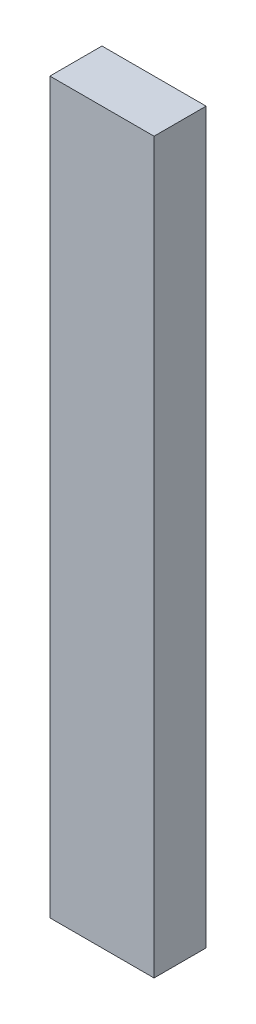
ISO-10303-21;
HEADER;
FILE_DESCRIPTION(('STEP AP214'),'2;1');
FILE_NAME('part.step','',(''),(''),'','','');
FILE_SCHEMA(('AUTOMOTIVE_DESIGN { 1 0 10303 214 1 1 1 1 }'));
ENDSEC;
DATA;
#1=APPLICATION_CONTEXT('core data for automotive mechanical design processes');
#2=APPLICATION_PROTOCOL_DEFINITION('international standard','automotive_design',2000,#1);
#3=PRODUCT_CONTEXT('',#1,'mechanical');
#4=PRODUCT('Part','Part','',(#3));
#5=PRODUCT_RELATED_PRODUCT_CATEGORY('part','',(#4));
#6=PRODUCT_DEFINITION_FORMATION('','',#4);
#7=PRODUCT_DEFINITION_CONTEXT('part definition',#1,'design');
#8=PRODUCT_DEFINITION('design','',#6,#7);
#9=PRODUCT_DEFINITION_SHAPE('','',#8);
#10=(LENGTH_UNIT() NAMED_UNIT(*) SI_UNIT(.MILLI.,.METRE.));
#11=(NAMED_UNIT(*) PLANE_ANGLE_UNIT() SI_UNIT($,.RADIAN.));
#12=(NAMED_UNIT(*) SI_UNIT($,.STERADIAN.) SOLID_ANGLE_UNIT());
#13=UNCERTAINTY_MEASURE_WITH_UNIT(LENGTH_MEASURE(1.E-05),#10,'distance_accuracy_value','');
#14=(GEOMETRIC_REPRESENTATION_CONTEXT(3) GLOBAL_UNCERTAINTY_ASSIGNED_CONTEXT((#13)) GLOBAL_UNIT_ASSIGNED_CONTEXT((#10,
#11,#12)) REPRESENTATION_CONTEXT('',''));
#15=CARTESIAN_POINT('',(0.,0.,0.));
#16=DIRECTION('',(0.,0.,1.));
#17=DIRECTION('',(1.,0.,0.));
#18=AXIS2_PLACEMENT_3D('',#15,#16,#17);
#19=CARTESIAN_POINT('',(-12.7,177.8,6.35));
#20=DIRECTION('',(1.,0.,0.));
#21=DIRECTION('',(0.,0.,-1.));
#22=AXIS2_PLACEMENT_3D('',#19,#20,#21);
#23=PLANE('',#22);
#24=DIRECTION('',(0.,0.,1.));
#25=VECTOR('',#24,1.);
#26=CARTESIAN_POINT('',(-12.7,0.,6.35));
#27=LINE('',#26,#25);
#28=CARTESIAN_POINT('',(-12.7,0.,-6.35));
#29=VERTEX_POINT('',#28);
#30=CARTESIAN_POINT('',(-12.7,0.,6.35));
#31=VERTEX_POINT('',#30);
#32=EDGE_CURVE('E96',#29,#31,#27,.T.);
#33=ORIENTED_EDGE('',*,*,#32,.T.);
#34=DIRECTION('',(0.,-1.,0.));
#35=VECTOR('',#34,1.);
#36=CARTESIAN_POINT('',(-12.7,177.8,6.35));
#37=LINE('',#36,#35);
#38=CARTESIAN_POINT('',(-12.7,177.8,6.35));
#39=VERTEX_POINT('',#38);
#40=EDGE_CURVE('E11',#39,#31,#37,.T.);
#41=ORIENTED_EDGE('',*,*,#40,.F.);
#42=DIRECTION('',(0.,0.,1.));
#43=VECTOR('',#42,1.);
#44=CARTESIAN_POINT('',(-12.7,177.8,6.35));
#45=LINE('',#44,#43);
#46=CARTESIAN_POINT('',(-12.7,177.8,-6.35));
#47=VERTEX_POINT('',#46);
#48=EDGE_CURVE('E84',#47,#39,#45,.T.);
#49=ORIENTED_EDGE('',*,*,#48,.F.);
#50=DIRECTION('',(0.,-1.,0.));
#51=VECTOR('',#50,1.);
#52=CARTESIAN_POINT('',(-12.7,177.8,-6.35));
#53=LINE('',#52,#51);
#54=EDGE_CURVE('E92',#47,#29,#53,.T.);
#55=ORIENTED_EDGE('',*,*,#54,.T.);
#56=EDGE_LOOP('',(#33,#41,#49,#55));
#57=FACE_BOUND('',#56,.T.);
#58=ADVANCED_FACE('F33',(#57),#23,.F.);
#59=CARTESIAN_POINT('',(12.7,177.8,6.35));
#60=DIRECTION('',(0.,0.,-1.));
#61=DIRECTION('',(-1.,0.,0.));
#62=AXIS2_PLACEMENT_3D('',#59,#60,#61);
#63=PLANE('',#62);
#64=DIRECTION('',(1.,0.,0.));
#65=VECTOR('',#64,1.);
#66=CARTESIAN_POINT('',(12.7,0.,6.35));
#67=LINE('',#66,#65);
#68=CARTESIAN_POINT('',(12.7,0.,6.35));
#69=VERTEX_POINT('',#68);
#70=EDGE_CURVE('E88',#31,#69,#67,.T.);
#71=ORIENTED_EDGE('',*,*,#70,.T.);
#72=DIRECTION('',(0.,-1.,0.));
#73=VECTOR('',#72,1.);
#74=CARTESIAN_POINT('',(12.7,177.8,6.35));
#75=LINE('',#74,#73);
#76=CARTESIAN_POINT('',(12.7,177.8,6.35));
#77=VERTEX_POINT('',#76);
#78=EDGE_CURVE('E41',#77,#69,#75,.T.);
#79=ORIENTED_EDGE('',*,*,#78,.F.);
#80=DIRECTION('',(1.,0.,0.));
#81=VECTOR('',#80,1.);
#82=CARTESIAN_POINT('',(12.7,177.8,6.35));
#83=LINE('',#82,#81);
#84=EDGE_CURVE('E79',#39,#77,#83,.T.);
#85=ORIENTED_EDGE('',*,*,#84,.F.);
#86=ORIENTED_EDGE('',*,*,#40,.T.);
#87=EDGE_LOOP('',(#71,#79,#85,#86));
#88=FACE_BOUND('',#87,.T.);
#89=ADVANCED_FACE('F87',(#88),#63,.F.);
#90=CARTESIAN_POINT('',(12.7,177.8,6.35));
#91=DIRECTION('',(-1.,0.,0.));
#92=DIRECTION('',(0.,0.,1.));
#93=AXIS2_PLACEMENT_3D('',#90,#91,#92);
#94=PLANE('',#93);
#95=DIRECTION('',(0.,0.,-1.));
#96=VECTOR('',#95,1.);
#97=CARTESIAN_POINT('',(12.7,0.,6.35));
#98=LINE('',#97,#96);
#99=CARTESIAN_POINT('',(12.7,0.,-6.35));
#100=VERTEX_POINT('',#99);
#101=EDGE_CURVE('E66',#69,#100,#98,.T.);
#102=ORIENTED_EDGE('',*,*,#101,.T.);
#103=DIRECTION('',(0.,-1.,0.));
#104=VECTOR('',#103,1.);
#105=CARTESIAN_POINT('',(12.7,177.8,-6.35));
#106=LINE('',#105,#104);
#107=CARTESIAN_POINT('',(12.7,177.8,-6.35));
#108=VERTEX_POINT('',#107);
#109=EDGE_CURVE('E89',#108,#100,#106,.T.);
#110=ORIENTED_EDGE('',*,*,#109,.F.);
#111=DIRECTION('',(0.,0.,-1.));
#112=VECTOR('',#111,1.);
#113=CARTESIAN_POINT('',(12.7,177.8,6.35));
#114=LINE('',#113,#112);
#115=EDGE_CURVE('E82',#77,#108,#114,.T.);
#116=ORIENTED_EDGE('',*,*,#115,.F.);
#117=ORIENTED_EDGE('',*,*,#78,.T.);
#118=EDGE_LOOP('',(#102,#110,#116,#117));
#119=FACE_BOUND('',#118,.T.);
#120=ADVANCED_FACE('F90',(#119),#94,.F.);
#121=CARTESIAN_POINT('',(12.7,177.8,-6.35));
#122=DIRECTION('',(0.,0.,1.));
#123=DIRECTION('',(1.,0.,0.));
#124=AXIS2_PLACEMENT_3D('',#121,#122,#123);
#125=PLANE('',#124);
#126=DIRECTION('',(-1.,0.,0.));
#127=VECTOR('',#126,1.);
#128=CARTESIAN_POINT('',(12.7,0.,-6.35));
#129=LINE('',#128,#127);
#130=EDGE_CURVE('E72',#100,#29,#129,.T.);
#131=ORIENTED_EDGE('',*,*,#130,.T.);
#132=ORIENTED_EDGE('',*,*,#54,.F.);
#133=DIRECTION('',(-1.,0.,0.));
#134=VECTOR('',#133,1.);
#135=CARTESIAN_POINT('',(12.7,177.8,-6.35));
#136=LINE('',#135,#134);
#137=EDGE_CURVE('E49',#108,#47,#136,.T.);
#138=ORIENTED_EDGE('',*,*,#137,.F.);
#139=ORIENTED_EDGE('',*,*,#109,.T.);
#140=EDGE_LOOP('',(#131,#132,#138,#139));
#141=FACE_BOUND('',#140,.T.);
#142=ADVANCED_FACE('F103',(#141),#125,.F.);
#143=CARTESIAN_POINT('',(0.,177.8,0.));
#144=DIRECTION('',(0.,1.,0.));
#145=DIRECTION('',(0.,0.,1.));
#146=AXIS2_PLACEMENT_3D('',#143,#144,#145);
#147=PLANE('',#146);
#148=ORIENTED_EDGE('',*,*,#48,.T.);
#149=ORIENTED_EDGE('',*,*,#84,.T.);
#150=ORIENTED_EDGE('',*,*,#115,.T.);
#151=ORIENTED_EDGE('',*,*,#137,.T.);
#152=EDGE_LOOP('',(#148,#149,#150,#151));
#153=FACE_BOUND('',#152,.T.);
#154=ADVANCED_FACE('F80',(#153),#147,.T.);
#155=CARTESIAN_POINT('',(0.,0.,0.));
#156=DIRECTION('',(0.,1.,0.));
#157=DIRECTION('',(0.,0.,1.));
#158=AXIS2_PLACEMENT_3D('',#155,#156,#157);
#159=PLANE('',#158);
#160=ORIENTED_EDGE('',*,*,#32,.F.);
#161=ORIENTED_EDGE('',*,*,#130,.F.);
#162=ORIENTED_EDGE('',*,*,#101,.F.);
#163=ORIENTED_EDGE('',*,*,#70,.F.);
#164=EDGE_LOOP('',(#160,#161,#162,#163));
#165=FACE_BOUND('',#164,.T.);
#166=ADVANCED_FACE('F106',(#165),#159,.F.);
#167=CLOSED_SHELL('',(#58,#89,#120,#142,#154,#166));
#168=MANIFOLD_SOLID_BREP('B2',#167);
#169=ADVANCED_BREP_SHAPE_REPRESENTATION('',(#18,#168),#14);
#170=SHAPE_DEFINITION_REPRESENTATION(#9,#169);
ENDSEC;
END-ISO-10303-21;
